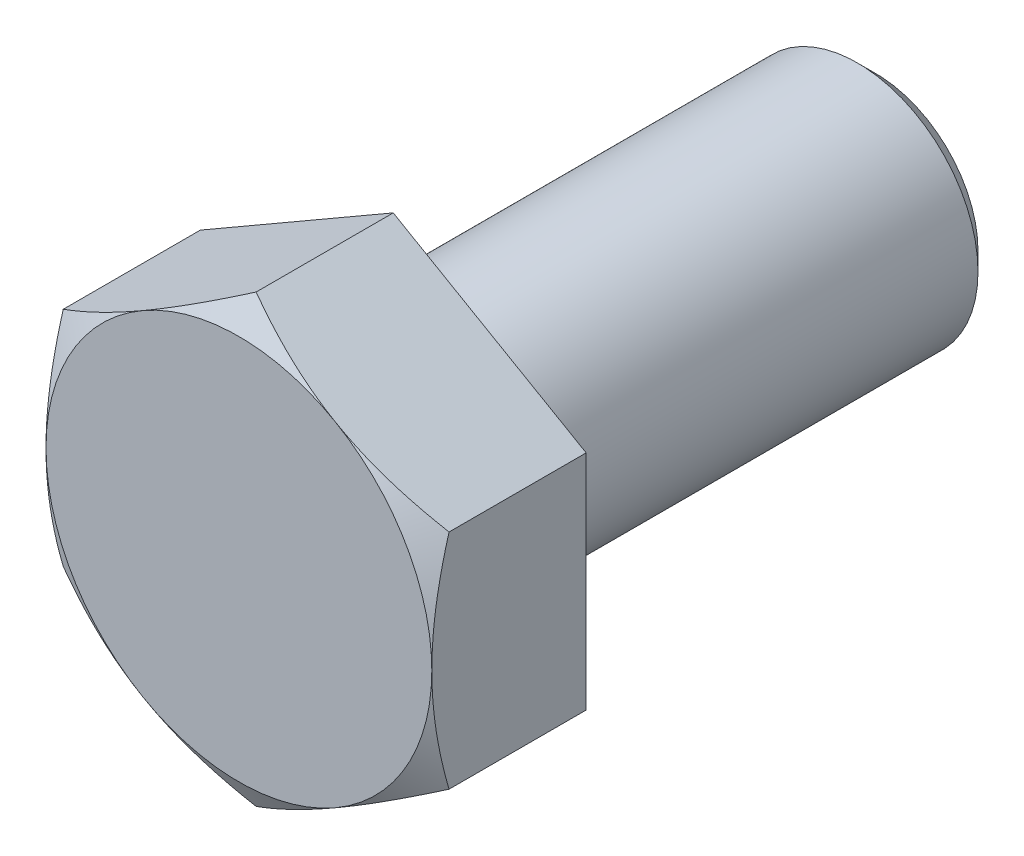
ISO-10303-21;
HEADER;
FILE_DESCRIPTION(('STEP AP214'),'2;1');
FILE_NAME('part.step','',(''),(''),'','','');
FILE_SCHEMA(('AUTOMOTIVE_DESIGN { 1 0 10303 214 1 1 1 1 }'));
ENDSEC;
DATA;
#1=APPLICATION_CONTEXT('core data for automotive mechanical design processes');
#2=APPLICATION_PROTOCOL_DEFINITION('international standard','automotive_design',2000,#1);
#3=PRODUCT_CONTEXT('',#1,'mechanical');
#4=PRODUCT('Part','Part','',(#3));
#5=PRODUCT_RELATED_PRODUCT_CATEGORY('part','',(#4));
#6=PRODUCT_DEFINITION_FORMATION('','',#4);
#7=PRODUCT_DEFINITION_CONTEXT('part definition',#1,'design');
#8=PRODUCT_DEFINITION('design','',#6,#7);
#9=PRODUCT_DEFINITION_SHAPE('','',#8);
#10=(LENGTH_UNIT() NAMED_UNIT(*) SI_UNIT(.MILLI.,.METRE.));
#11=(NAMED_UNIT(*) PLANE_ANGLE_UNIT() SI_UNIT($,.RADIAN.));
#12=(NAMED_UNIT(*) SI_UNIT($,.STERADIAN.) SOLID_ANGLE_UNIT());
#13=UNCERTAINTY_MEASURE_WITH_UNIT(LENGTH_MEASURE(1.E-05),#10,'distance_accuracy_value','');
#14=(GEOMETRIC_REPRESENTATION_CONTEXT(3) GLOBAL_UNCERTAINTY_ASSIGNED_CONTEXT((#13)) GLOBAL_UNIT_ASSIGNED_CONTEXT((#10,
#11,#12)) REPRESENTATION_CONTEXT('',''));
#15=CARTESIAN_POINT('',(0.,0.,0.));
#16=DIRECTION('',(0.,0.,1.));
#17=DIRECTION('',(1.,0.,0.));
#18=AXIS2_PLACEMENT_3D('',#15,#16,#17);
#19=CARTESIAN_POINT('',(3.79177104354675E-06,-4.33273048109597E-05,1.34810339188749));
#20=DIRECTION('',(0.,0.,1.));
#21=DIRECTION('',(1.,0.,0.));
#22=AXIS2_PLACEMENT_3D('',#19,#20,#21);
#23=PLANE('',#22);
#24=CARTESIAN_POINT('',(3.79177104306103E-06,-4.33273048103352E-05,1.3481033922876));
#25=DIRECTION('',(0.,0.,-1.));
#26=DIRECTION('',(-1.,0.,0.));
#27=AXIS2_PLACEMENT_3D('',#24,#25,#26);
#28=CIRCLE('',#27,4.000000000231);
#29=CARTESIAN_POINT('',(1.99991578795662,3.46410909550182,1.34810339235428));
#30=VERTEX_POINT('',#29);
#31=CARTESIAN_POINT('',(4.00000379188654,-4.33273048100741E-05,1.34810339235428));
#32=VERTEX_POINT('',#31);
#33=EDGE_CURVE('E361',#30,#32,#28,.T.);
#34=ORIENTED_EDGE('',*,*,#33,.F.);
#35=CARTESIAN_POINT('',(3.79177104306103E-06,-4.33273048103352E-05,1.3481033922876));
#36=DIRECTION('',(0.,0.,-1.));
#37=DIRECTION('',(-1.,0.,0.));
#38=AXIS2_PLACEMENT_3D('',#35,#36,#37);
#39=CIRCLE('',#38,4.000000000231);
#40=CARTESIAN_POINT('',(-1.99990820441454,3.46410909550181,1.34810339235428));
#41=VERTEX_POINT('',#40);
#42=EDGE_CURVE('E112',#41,#30,#39,.T.);
#43=ORIENTED_EDGE('',*,*,#42,.F.);
#44=CARTESIAN_POINT('',(3.79177104306103E-06,-4.33273048103352E-05,1.3481033922876));
#45=DIRECTION('',(0.,0.,-1.));
#46=DIRECTION('',(-1.,0.,0.));
#47=AXIS2_PLACEMENT_3D('',#44,#45,#46);
#48=CIRCLE('',#47,4.000000000231);
#49=CARTESIAN_POINT('',(-3.99999620834446,-4.3327304810564E-05,1.34810339235428));
#50=VERTEX_POINT('',#49);
#51=EDGE_CURVE('E108',#50,#41,#48,.T.);
#52=ORIENTED_EDGE('',*,*,#51,.F.);
#53=CARTESIAN_POINT('',(3.79177104306103E-06,-4.33273048103352E-05,1.3481033922876));
#54=DIRECTION('',(0.,0.,-1.));
#55=DIRECTION('',(-1.,0.,0.));
#56=AXIS2_PLACEMENT_3D('',#53,#54,#55);
#57=CIRCLE('',#56,4.000000000231);
#58=CARTESIAN_POINT('',(-1.99990820441453,-3.46419575011144,1.34810339235428));
#59=VERTEX_POINT('',#58);
#60=EDGE_CURVE('E106',#59,#50,#57,.T.);
#61=ORIENTED_EDGE('',*,*,#60,.F.);
#62=CARTESIAN_POINT('',(3.79177104307789E-06,-4.33273048103352E-05,1.3481033922876));
#63=DIRECTION('',(0.,0.,-1.));
#64=DIRECTION('',(-1.,0.,0.));
#65=AXIS2_PLACEMENT_3D('',#62,#63,#64);
#66=CIRCLE('',#65,4.000000000231);
#67=CARTESIAN_POINT('',(1.99991578795662,-3.46419575011144,1.34810339235428));
#68=VERTEX_POINT('',#67);
#69=EDGE_CURVE('E39',#68,#59,#66,.T.);
#70=ORIENTED_EDGE('',*,*,#69,.F.);
#71=CARTESIAN_POINT('',(3.79177104306103E-06,-4.33273048103352E-05,1.3481033922876));
#72=DIRECTION('',(0.,0.,-1.));
#73=DIRECTION('',(-1.,0.,0.));
#74=AXIS2_PLACEMENT_3D('',#71,#72,#73);
#75=CIRCLE('',#74,4.000000000231);
#76=EDGE_CURVE('E123',#32,#68,#75,.T.);
#77=ORIENTED_EDGE('',*,*,#76,.F.);
#78=EDGE_LOOP('',(#34,#43,#52,#61,#70,#77));
#79=FACE_BOUND('',#78,.T.);
#80=ADVANCED_FACE('F36',(#79),#23,.T.);
#81=CARTESIAN_POINT('',(3.79177104306103E-06,-4.33273048103352E-05,0.988733553872926));
#82=DIRECTION('',(0.,0.,-1.));
#83=DIRECTION('',(-1.,0.,0.));
#84=AXIS2_PLACEMENT_3D('',#81,#82,#83);
#85=CONICAL_SURFACE('',#84,4.62244681735294,1.04719755);
#86=ORIENTED_EDGE('',*,*,#69,.T.);
#87=CARTESIAN_POINT('',(3.79163709457141E-06,-4.61877773840974,0.990876912722294));
#88=CARTESIAN_POINT('',(-0.162788497504231,-4.52479508048307,1.04515145101499));
#89=CARTESIAN_POINT('',(-0.326884413345985,-4.4300598175244,1.09487619982928));
#90=CARTESIAN_POINT('',(-0.656522634689989,-4.23975426717159,1.18256466618629));
#91=CARTESIAN_POINT('',(-0.822053443931,-4.14419061675741,1.22058653471871));
#92=CARTESIAN_POINT('',(-1.07191170370882,-3.99994334640708,1.26727081158041));
#93=CARTESIAN_POINT('',(-1.15551337791084,-3.9516787290539,1.28111314895853));
#94=CARTESIAN_POINT('',(-1.32311691933625,-3.85491845635499,1.30507449792997));
#95=CARTESIAN_POINT('',(-1.40711877597122,-3.80642280712212,1.31519360748801));
#96=CARTESIAN_POINT('',(-1.57583336835302,-3.70902110648849,1.33153072770129));
#97=CARTESIAN_POINT('',(-1.66054755588023,-3.6601142169511,1.33772890127366));
#98=CARTESIAN_POINT('',(-1.83014251453472,-3.56220426643249,1.3460238116594));
#99=CARTESIAN_POINT('',(-1.91502331531653,-3.51320118833122,1.34811973638863));
#100=CARTESIAN_POINT('',(-1.99990820434845,-3.46419575001622,1.34810339242096));
#101=B_SPLINE_CURVE_WITH_KNOTS('',3,(#87,#88,#89,#90,#91,#92,#93,#94,#95,#96,#97,#98,#99,#100),
.UNSPECIFIED.,.F.,.F.,(4,2,2,2,2,2,4),(0.,0.587193956710365,1.1714212338006,1.46391811883855,
1.75640730721482,2.05036468614835,2.34438025121384),.UNSPECIFIED.);
#102=CARTESIAN_POINT('',(3.79171869659006E-06,-4.61877773836004,0.990876912654175));
#103=VERTEX_POINT('',#102);
#104=EDGE_CURVE('E118',#103,#59,#101,.T.);
#105=ORIENTED_EDGE('',*,*,#104,.F.);
#106=CARTESIAN_POINT('',(1.99991578787,-3.46419574996139,1.34810339238762));
#107=CARTESIAN_POINT('',(1.91503089885496,-3.51320118830945,1.34811973637682));
#108=CARTESIAN_POINT('',(1.83015009807931,-3.56220426642466,1.3460238116564));
#109=CARTESIAN_POINT('',(1.66055513942802,-3.66011421695419,1.33772890127706));
#110=CARTESIAN_POINT('',(1.57584095189786,-3.70902110648856,1.3315307277023));
#111=CARTESIAN_POINT('',(1.40712635951324,-3.80642280712052,1.31519360748726));
#112=CARTESIAN_POINT('',(1.32312450287839,-3.85491845635471,1.30507449792987));
#113=CARTESIAN_POINT('',(1.15552096145219,-3.95167872905458,1.28111314895852));
#114=CARTESIAN_POINT('',(1.07191928724927,-3.99994334640739,1.26727081157983));
#115=CARTESIAN_POINT('',(0.822061027470187,-4.14419061676036,1.22058653471873));
#116=CARTESIAN_POINT('',(0.656530218230293,-4.23975426718124,1.18256466618979));
#117=CARTESIAN_POINT('',(0.326891996877726,-4.43005981752171,1.09487619982253));
#118=CARTESIAN_POINT('',(0.16279608102625,-4.52479508046119,1.04515145099437));
#119=CARTESIAN_POINT('',(3.79186307492258E-06,-4.61877773833713,0.990876912667401));
#120=B_SPLINE_CURVE_WITH_KNOTS('',3,(#106,#107,#108,#109,#110,#111,#112,#113,#114,#115,#116,
#117,#118,#119),.UNSPECIFIED.,.F.,.F.,(4,2,2,2,2,2,4),(0.,0.29401556506985,0.587972944006674,
0.880462132384534,1.17295901742455,1.75718629451911,2.34438025123659),.UNSPECIFIED.);
#121=EDGE_CURVE('E121',#68,#103,#120,.T.);
#122=ORIENTED_EDGE('',*,*,#121,.F.);
#123=EDGE_LOOP('',(#86,#105,#122));
#124=FACE_BOUND('',#123,.T.);
#125=ADVANCED_FACE('F116',(#124),#85,.T.);
#126=CARTESIAN_POINT('',(3.79177104306103E-06,-4.33273048103352E-05,0.988674534124086));
#127=DIRECTION('',(0.,0.,-1.));
#128=DIRECTION('',(-1.,0.,0.));
#129=AXIS2_PLACEMENT_3D('',#126,#127,#128);
#130=CONICAL_SURFACE('',#129,4.6225490425563,1.04719755);
#131=ORIENTED_EDGE('',*,*,#76,.T.);
#132=CARTESIAN_POINT('',(4.00000379172091,-2.3095121496015,0.990818244979904));
#133=CARTESIAN_POINT('',(3.83719763281116,-2.40350281464689,1.04510097104329));
#134=CARTESIAN_POINT('',(3.67308762745474,-2.49824621166345,1.09483352723444));
#135=CARTESIAN_POINT('',(3.34342095346018,-2.68856818816269,1.1825361111439));
#136=CARTESIAN_POINT('',(3.17787578480175,-2.78414012851837,1.2205643043841));
#137=CARTESIAN_POINT('',(2.92799560556909,-2.92840005333423,1.26725653055035));
#138=CARTESIAN_POINT('',(2.84438654192603,-2.97666893673172,1.28110126396343));
#139=CARTESIAN_POINT('',(2.67676812283042,-3.07343779855272,1.30506679889541));
#140=CARTESIAN_POINT('',(2.59275877797436,-3.12193777085871,1.31518769844517));
#141=CARTESIAN_POINT('',(2.42402904308853,-3.21934821350847,1.33152773188274));
#142=CARTESIAN_POINT('',(2.33930720071613,-3.26825952231344,1.33772702279641));
#143=CARTESIAN_POINT('',(2.16969688465878,-3.36617833891242,1.34602343422096));
#144=CARTESIAN_POINT('',(2.08480838130078,-3.41518586383716,1.34811974221371));
#145=CARTESIAN_POINT('',(1.99991578790721,-3.4641957500066,1.34810339242096));
#146=B_SPLINE_CURVE_WITH_KNOTS('',3,(#132,#133,#134,#135,#136,#137,#138,#139,#140,#141,#142,
#143,#144,#145),.UNSPECIFIED.,.F.,.F.,(4,2,2,2,2,2,4),(0.,0.5872470121739,1.17152670288262,
1.46404993062694,1.75656545707178,2.05054948889577,2.34459173280619),.UNSPECIFIED.);
#147=CARTESIAN_POINT('',(4.00000379171867,-2.30951214950594,0.990818244911756));
#148=VERTEX_POINT('',#147);
#149=EDGE_CURVE('E132',#148,#68,#146,.T.);
#150=ORIENTED_EDGE('',*,*,#149,.F.);
#151=CARTESIAN_POINT('',(4.00000379171329,-4.33273048103028E-05,1.34810339238762));
#152=CARTESIAN_POINT('',(4.00000379175031,-0.098067412895049,1.3481197422019));
#153=CARTESIAN_POINT('',(4.00000379176549,-0.196086775787946,1.34602343421796));
#154=CARTESIAN_POINT('',(4.0000037917766,-0.391933026602892,1.33772702279981));
#155=CARTESIAN_POINT('',(4.00000379177253,-0.48975994878791,1.33152773188375));
#156=CARTESIAN_POINT('',(4.00000379176956,-0.684589406962215,1.31518769844443));
#157=CARTESIAN_POINT('',(4.00000379177064,-0.781593619947711,1.30506679889531));
#158=CARTESIAN_POINT('',(4.00000379177145,-0.97513986000081,1.28110126396342));
#159=CARTESIAN_POINT('',(4.00000379177119,-1.07168187483282,1.26725653054976));
#160=CARTESIAN_POINT('',(4.00000379177075,-1.36021442045396,1.22056430438412));
#161=CARTESIAN_POINT('',(4.00000379177089,-1.55136671222785,1.1825361111474));
#162=CARTESIAN_POINT('',(4.00000379177119,-1.93202741506196,1.09483352722769));
#163=CARTESIAN_POINT('',(4.00000379177134,-2.12152254728407,1.04510097102265));
#164=CARTESIAN_POINT('',(4.00000379177104,-2.3095121493694,0.990818244924989));
#165=B_SPLINE_CURVE_WITH_KNOTS('',3,(#151,#152,#153,#154,#155,#156,#157,#158,#159,#160,#161,
#162,#163,#164),.UNSPECIFIED.,.F.,.F.,(4,2,2,2,2,2,4),(0.,0.294042243914776,0.58802627574207,
0.880541802188493,1.17306502993488,1.75734472064793,2.34459173282895),.UNSPECIFIED.);
#166=EDGE_CURVE('E166',#32,#148,#165,.T.);
#167=ORIENTED_EDGE('',*,*,#166,.F.);
#168=EDGE_LOOP('',(#131,#150,#167));
#169=FACE_BOUND('',#168,.T.);
#170=ADVANCED_FACE('F156',(#169),#130,.T.);
#171=CARTESIAN_POINT('',(3.79177104306103E-06,-4.33273048103352E-05,0.988674534124084));
#172=DIRECTION('',(0.,0.,-1.));
#173=DIRECTION('',(-1.,0.,0.));
#174=AXIS2_PLACEMENT_3D('',#171,#172,#173);
#175=CONICAL_SURFACE('',#174,4.6225490425563,1.04719755);
#176=CARTESIAN_POINT('',(1.99991578787,3.46410909535178,1.34810339238762));
#177=CARTESIAN_POINT('',(2.08480838128376,3.41509920921349,1.3481197422019));
#178=CARTESIAN_POINT('',(2.16969688465074,3.36609168430106,1.34602343421796));
#179=CARTESIAN_POINT('',(2.33930720071595,3.26817286771031,1.33772702279981));
#180=CARTESIAN_POINT('',(2.42402904308721,3.21926155890127,1.33152773188375));
#181=CARTESIAN_POINT('',(2.59275877797301,3.12185111624823,1.31518769844443));
#182=CARTESIAN_POINT('',(2.67676812283016,3.073351143943,1.30506679889532));
#183=CARTESIAN_POINT('',(2.84438654192699,2.9765822821218,1.28110126396342));
#184=CARTESIAN_POINT('',(2.92799560557018,2.92831339872335,1.26725653054976));
#185=CARTESIAN_POINT('',(3.17787578480575,2.78405347390771,1.22056430438412));
#186=CARTESIAN_POINT('',(3.34342095346943,2.68848153355636,1.1825361111474));
#187=CARTESIAN_POINT('',(3.67308762745758,2.49815955704352,1.09483352722769));
#188=CARTESIAN_POINT('',(3.83719763280224,2.40341616000894,1.04510097102265));
#189=CARTESIAN_POINT('',(4.00000379167898,2.30942549491924,0.990818244924989));
#190=B_SPLINE_CURVE_WITH_KNOTS('',3,(#176,#177,#178,#179,#180,#181,#182,#183,#184,#185,#186,
#187,#188,#189),.UNSPECIFIED.,.F.,.F.,(4,2,2,2,2,2,4),(0.,0.294042243914777,0.588026275742071,
0.880541802188495,1.17306502993488,1.75734472064793,2.34459173282895),.UNSPECIFIED.);
#191=CARTESIAN_POINT('',(4.00000379177104,2.30942549480562,0.990818244911756));
#192=VERTEX_POINT('',#191);
#193=EDGE_CURVE('E198',#30,#192,#190,.T.);
#194=ORIENTED_EDGE('',*,*,#193,.F.);
#195=ORIENTED_EDGE('',*,*,#33,.T.);
#196=CARTESIAN_POINT('',(4.00000379185492,2.30942549475978,0.990818244979903));
#197=CARTESIAN_POINT('',(4.00000379180034,2.12143589266801,1.04510097104328));
#198=CARTESIAN_POINT('',(4.0000037917787,1.93194076044472,1.09483352723444));
#199=CARTESIAN_POINT('',(4.00000379176342,1.55128005761185,1.1825361111439));
#200=CARTESIAN_POINT('',(4.00000379176965,1.36012776584035,1.2205643043841));
#201=CARTESIAN_POINT('',(4.00000379177174,1.07159522022162,1.26725653055035));
#202=CARTESIAN_POINT('',(4.00000379177123,0.975053205390207,1.28110126396343));
#203=CARTESIAN_POINT('',(4.00000379177085,0.781506965338266,1.30506679889541));
#204=CARTESIAN_POINT('',(4.00000379177099,0.684502752353332,1.31518769844517));
#205=CARTESIAN_POINT('',(4.0000037917711,0.489673294180637,1.33152773188274));
#206=CARTESIAN_POINT('',(4.00000379177107,0.391846371996666,1.33772702279641));
#207=CARTESIAN_POINT('',(4.00000379177102,0.196000121184402,1.34602343422096));
#208=CARTESIAN_POINT('',(4.00000379177099,0.0979807582931406,1.34811974221371));
#209=CARTESIAN_POINT('',(4.00000379177104,-4.33272951850333E-05,1.34810339242096));
#210=B_SPLINE_CURVE_WITH_KNOTS('',3,(#196,#197,#198,#199,#200,#201,#202,#203,#204,#205,#206,
#207,#208,#209),.UNSPECIFIED.,.F.,.F.,(4,2,2,2,2,2,4),(0.,0.587247012173901,1.17152670288262,
1.46404993062695,1.75656545707178,2.05054948889577,2.34459173280619),.UNSPECIFIED.);
#211=EDGE_CURVE('E191',#192,#32,#210,.T.);
#212=ORIENTED_EDGE('',*,*,#211,.F.);
#213=EDGE_LOOP('',(#194,#195,#212));
#214=FACE_BOUND('',#213,.T.);
#215=ADVANCED_FACE('F205',(#214),#175,.T.);
#216=CARTESIAN_POINT('',(3.79177104306103E-06,-4.33273048103352E-05,0.988733553872927));
#217=DIRECTION('',(0.,0.,-1.));
#218=DIRECTION('',(-1.,0.,0.));
#219=AXIS2_PLACEMENT_3D('',#216,#217,#218);
#220=CONICAL_SURFACE('',#219,4.62244681735294,1.04719755);
#221=CARTESIAN_POINT('',(-1.99990820432792,3.46410909535177,1.34810339238762));
#222=CARTESIAN_POINT('',(-1.91502331531287,3.51311453369983,1.34811973637682));
#223=CARTESIAN_POINT('',(-1.83014251453722,3.56211761181504,1.3460238116564));
#224=CARTESIAN_POINT('',(-1.66054755588594,3.66002756234457,1.33772890127706));
#225=CARTESIAN_POINT('',(-1.57583336835577,3.70893445187894,1.3315307277023));
#226=CARTESIAN_POINT('',(-1.40711877597115,3.8063361525109,1.31519360748726));
#227=CARTESIAN_POINT('',(-1.3231169193363,3.85483180174509,1.30507449792987));
#228=CARTESIAN_POINT('',(-1.1555133779101,3.95159207444496,1.28111314895852));
#229=CARTESIAN_POINT('',(-1.07191170370719,3.99985669179777,1.26727081157983));
#230=CARTESIAN_POINT('',(-0.8220534439281,4.14410396215074,1.22058653471873));
#231=CARTESIAN_POINT('',(-0.656522634688207,4.23966761257162,1.18256466618979));
#232=CARTESIAN_POINT('',(-0.32688441333564,4.42997316291209,1.09487619982253));
#233=CARTESIAN_POINT('',(-0.162788497484165,4.52470842585157,1.04515145099437));
#234=CARTESIAN_POINT('',(3.79167901134691E-06,4.61869108372751,0.9908769126674));
#235=B_SPLINE_CURVE_WITH_KNOTS('',3,(#221,#222,#223,#224,#225,#226,#227,#228,#229,#230,#231,
#232,#233,#234),.UNSPECIFIED.,.F.,.F.,(4,2,2,2,2,2,4),(0.,0.29401556506985,0.587972944006674,
0.880462132384535,1.17295901742455,1.75718629451911,2.34438025123659),.UNSPECIFIED.);
#236=CARTESIAN_POINT('',(3.79182338848649E-06,4.61869108375042,0.990876912654174));
#237=VERTEX_POINT('',#236);
#238=EDGE_CURVE('E223',#41,#237,#235,.T.);
#239=ORIENTED_EDGE('',*,*,#238,.F.);
#240=ORIENTED_EDGE('',*,*,#42,.T.);
#241=CARTESIAN_POINT('',(3.79190499087101E-06,4.61869108380013,0.990876912722296));
#242=CARTESIAN_POINT('',(0.162796081046316,4.52470842587345,1.04515145101499));
#243=CARTESIAN_POINT('',(0.32689199688807,4.42997316291478,1.09487619982928));
#244=CARTESIAN_POINT('',(0.656530218232073,4.23966761256197,1.18256466618629));
#245=CARTESIAN_POINT('',(0.822061027473085,4.14410396214779,1.22058653471871));
#246=CARTESIAN_POINT('',(1.07191928725091,3.99985669179746,1.26727081158041));
#247=CARTESIAN_POINT('',(1.15552096145292,3.95159207444428,1.28111314895853));
#248=CARTESIAN_POINT('',(1.32312450287834,3.85483180174537,1.30507449792997));
#249=CARTESIAN_POINT('',(1.40712635951331,3.8063361525125,1.31519360748801));
#250=CARTESIAN_POINT('',(1.5758409518951,3.70893445187887,1.33153072770129));
#251=CARTESIAN_POINT('',(1.66055513942231,3.66002756234148,1.33772890127366));
#252=CARTESIAN_POINT('',(1.8301500980768,3.56211761182287,1.3460238116594));
#253=CARTESIAN_POINT('',(1.91503089885862,3.5131145337216,1.34811973638863));
#254=CARTESIAN_POINT('',(1.99991578789053,3.4641090954066,1.34810339242096));
#255=B_SPLINE_CURVE_WITH_KNOTS('',3,(#241,#242,#243,#244,#245,#246,#247,#248,#249,#250,#251,
#252,#253,#254),.UNSPECIFIED.,.F.,.F.,(4,2,2,2,2,2,4),(0.,0.587193956710364,1.1714212338006,
1.46391811883856,1.75640730721482,2.05036468614835,2.34438025121384),.UNSPECIFIED.);
#256=EDGE_CURVE('E217',#237,#30,#255,.T.);
#257=ORIENTED_EDGE('',*,*,#256,.F.);
#258=EDGE_LOOP('',(#239,#240,#257));
#259=FACE_BOUND('',#258,.T.);
#260=ADVANCED_FACE('F209',(#259),#220,.T.);
#261=CARTESIAN_POINT('',(3.79177104306103E-06,-4.33273048103352E-05,0.988674534124085));
#262=DIRECTION('',(0.,0.,-1.));
#263=DIRECTION('',(-1.,0.,0.));
#264=AXIS2_PLACEMENT_3D('',#261,#262,#263);
#265=CONICAL_SURFACE('',#264,4.6225490425563,1.04719755);
#266=ORIENTED_EDGE('',*,*,#60,.T.);
#267=CARTESIAN_POINT('',(-3.99999620831283,-2.30951214936941,0.990818244979903));
#268=CARTESIAN_POINT('',(-3.99999620825825,-2.12152254727763,1.04510097104329));
#269=CARTESIAN_POINT('',(-3.99999620823661,-1.93202741505434,1.09483352723444));
#270=CARTESIAN_POINT('',(-3.99999620822134,-1.55136671222147,1.1825361111439));
#271=CARTESIAN_POINT('',(-3.99999620822756,-1.36021442044997,1.2205643043841));
#272=CARTESIAN_POINT('',(-3.99999620822966,-1.07168187483125,1.26725653055035));
#273=CARTESIAN_POINT('',(-3.99999620822914,-0.975139859999829,1.28110126396343));
#274=CARTESIAN_POINT('',(-3.99999620822877,-0.781593619947887,1.30506679889541));
#275=CARTESIAN_POINT('',(-3.9999962082289,-0.684589406962954,1.31518769844517));
#276=CARTESIAN_POINT('',(-3.99999620822901,-0.489759948790258,1.33152773188274));
#277=CARTESIAN_POINT('',(-3.99999620822898,-0.391933026606288,1.33772702279641));
#278=CARTESIAN_POINT('',(-3.99999620822893,-0.196086775794023,1.34602343422096));
#279=CARTESIAN_POINT('',(-3.9999962082289,-0.0980674129027621,1.34811974221371));
#280=CARTESIAN_POINT('',(-3.99999620822896,-4.33273144365134E-05,1.34810339242096));
#281=B_SPLINE_CURVE_WITH_KNOTS('',3,(#267,#268,#269,#270,#271,#272,#273,#274,#275,#276,#277,
#278,#279,#280),.UNSPECIFIED.,.F.,.F.,(4,2,2,2,2,2,4),(0.,0.587247012173901,1.17152670288262,
1.46404993062695,1.75656545707178,2.05054948889577,2.34459173280619),.UNSPECIFIED.);
#282=CARTESIAN_POINT('',(-3.99999620817659,-2.30951214944548,0.990818244929212));
#283=VERTEX_POINT('',#282);
#284=EDGE_CURVE('E128',#283,#50,#281,.T.);
#285=ORIENTED_EDGE('',*,*,#284,.F.);
#286=CARTESIAN_POINT('',(-1.99990820432791,-3.4641957499614,1.34810339238762));
#287=CARTESIAN_POINT('',(-2.08480079774167,-3.41518586382311,1.3481197422019));
#288=CARTESIAN_POINT('',(-2.16968930110866,-3.36617833891068,1.34602343421796));
#289=CARTESIAN_POINT('',(-2.33929961717386,-3.26825952231993,1.33772702279981));
#290=CARTESIAN_POINT('',(-2.42402145954512,-3.21934821351089,1.33152773188375));
#291=CARTESIAN_POINT('',(-2.59275119443092,-3.12193777085785,1.31518769844443));
#292=CARTESIAN_POINT('',(-2.67676053928807,-3.07343779855262,1.30506679889532));
#293=CARTESIAN_POINT('',(-2.8443789583849,-2.97666893673142,1.28110126396342));
#294=CARTESIAN_POINT('',(-2.92798802202809,-2.92840005333297,1.26725653054976));
#295=CARTESIAN_POINT('',(-3.17786820126367,-2.78414012851733,1.22056430438412));
#296=CARTESIAN_POINT('',(-3.34341336992735,-2.68856818816598,1.1825361111474));
#297=CARTESIAN_POINT('',(-3.67308004391549,-2.49824621165314,1.09483352722769));
#298=CARTESIAN_POINT('',(-3.83719004926015,-2.40350281461856,1.04510097102265));
#299=CARTESIAN_POINT('',(-3.99999620813689,-2.30951214952887,0.990818244924989));
#300=B_SPLINE_CURVE_WITH_KNOTS('',3,(#286,#287,#288,#289,#290,#291,#292,#293,#294,#295,#296,
#297,#298,#299),.UNSPECIFIED.,.F.,.F.,(4,2,2,2,2,2,4),(0.,0.294042243914777,0.588026275742071,
0.880541802188494,1.17306502993488,1.75734472064793,2.34459173282895),.UNSPECIFIED.);
#301=EDGE_CURVE('E125',#59,#283,#300,.T.);
#302=ORIENTED_EDGE('',*,*,#301,.F.);
#303=EDGE_LOOP('',(#266,#285,#302));
#304=FACE_BOUND('',#303,.T.);
#305=ADVANCED_FACE('F126',(#304),#265,.T.);
#306=CARTESIAN_POINT('',(3.79177104306103E-06,-4.33273048103352E-05,0.988674534124086));
#307=DIRECTION('',(0.,0.,-1.));
#308=DIRECTION('',(-1.,0.,0.));
#309=AXIS2_PLACEMENT_3D('',#306,#307,#308);
#310=CONICAL_SURFACE('',#309,4.6225490425563,1.04719755);
#311=ORIENTED_EDGE('',*,*,#51,.T.);
#312=CARTESIAN_POINT('',(-3.99999620817883,2.30942549499188,0.990818244979904));
#313=CARTESIAN_POINT('',(-3.83719004926907,2.40341616003727,1.04510097104329));
#314=CARTESIAN_POINT('',(-3.67308004391265,2.49815955705383,1.09483352723444));
#315=CARTESIAN_POINT('',(-3.34341336991809,2.68848153355307,1.1825361111439));
#316=CARTESIAN_POINT('',(-3.17786820125966,2.78405347390875,1.2205643043841));
#317=CARTESIAN_POINT('',(-2.92798802202701,2.92831339872461,1.26725653055035));
#318=CARTESIAN_POINT('',(-2.84437895838394,2.9765822821221,1.28110126396343));
#319=CARTESIAN_POINT('',(-2.67676053928834,3.0733511439431,1.30506679889541));
#320=CARTESIAN_POINT('',(-2.59275119443228,3.12185111624909,1.31518769844517));
#321=CARTESIAN_POINT('',(-2.42402145954644,3.21926155889885,1.33152773188274));
#322=CARTESIAN_POINT('',(-2.33929961717405,3.26817286770382,1.33772702279641));
#323=CARTESIAN_POINT('',(-2.16968930111669,3.3660916843028,1.34602343422096));
#324=CARTESIAN_POINT('',(-2.0848007977587,3.41509920922754,1.34811974221371));
#325=CARTESIAN_POINT('',(-1.99990820436513,3.46410909539697,1.34810339242096));
#326=B_SPLINE_CURVE_WITH_KNOTS('',3,(#312,#313,#314,#315,#316,#317,#318,#319,#320,#321,#322,
#323,#324,#325),.UNSPECIFIED.,.F.,.F.,(4,2,2,2,2,2,4),(0.,0.5872470121739,1.17152670288262,
1.46404993062694,1.75656545707177,2.05054948889577,2.34459173280619),.UNSPECIFIED.);
#327=CARTESIAN_POINT('',(-3.99999620817659,2.30942549489632,0.990818244911758));
#328=VERTEX_POINT('',#327);
#329=EDGE_CURVE('E231',#328,#41,#326,.T.);
#330=ORIENTED_EDGE('',*,*,#329,.F.);
#331=CARTESIAN_POINT('',(-3.99999620817121,-4.33273048107927E-05,1.34810339238762));
#332=CARTESIAN_POINT('',(-3.99999620820822,0.0979807582854278,1.3481197422019));
#333=CARTESIAN_POINT('',(-3.9999962082234,0.196000121178325,1.34602343421796));
#334=CARTESIAN_POINT('',(-3.99999620823451,0.391846371993272,1.33772702279981));
#335=CARTESIAN_POINT('',(-3.99999620823044,0.489673294178289,1.33152773188375));
#336=CARTESIAN_POINT('',(-3.99999620822748,0.684502752352594,1.31518769844443));
#337=CARTESIAN_POINT('',(-3.99999620822855,0.78150696533809,1.30506679889532));
#338=CARTESIAN_POINT('',(-3.99999620822936,0.975053205391188,1.28110126396342));
#339=CARTESIAN_POINT('',(-3.9999962082291,1.0715952202232,1.26725653054976));
#340=CARTESIAN_POINT('',(-3.99999620822866,1.36012776584434,1.22056430438412));
#341=CARTESIAN_POINT('',(-3.99999620822881,1.55128005761823,1.1825361111474));
#342=CARTESIAN_POINT('',(-3.99999620822911,1.93194076045234,1.09483352722769));
#343=CARTESIAN_POINT('',(-3.99999620822925,2.12143589267445,1.04510097102265));
#344=CARTESIAN_POINT('',(-3.99999620822896,2.30942549475978,0.99081824492499));
#345=B_SPLINE_CURVE_WITH_KNOTS('',3,(#331,#332,#333,#334,#335,#336,#337,#338,#339,#340,#341,
#342,#343,#344),.UNSPECIFIED.,.F.,.F.,(4,2,2,2,2,2,4),(0.,0.294042243914776,0.58802627574207,
0.880541802188493,1.17306502993488,1.75734472064793,2.34459173282894),.UNSPECIFIED.);
#346=EDGE_CURVE('E251',#50,#328,#345,.T.);
#347=ORIENTED_EDGE('',*,*,#346,.F.);
#348=EDGE_LOOP('',(#311,#330,#347));
#349=FACE_BOUND('',#348,.T.);
#350=ADVANCED_FACE('F436',(#349),#310,.T.);
#351=CARTESIAN_POINT('',(3.79177104583659E-06,-4.61877773839026,-1.85189660811251));
#352=DIRECTION('',(-0.499977999031957,-0.86603810567665,0.));
#353=DIRECTION('',(0.86603810567665,-0.499977999031957,0.));
#354=AXIS2_PLACEMENT_3D('',#351,#352,#353);
#355=PLANE('',#354);
#356=DIRECTION('',(0.86603810567665,-0.499977999031957,0.));
#357=VECTOR('',#356,1.);
#358=CARTESIAN_POINT('',(-3.99999620822896,-2.30951214947571,-1.85189660811251));
#359=LINE('',#358,#357);
#360=CARTESIAN_POINT('',(-3.99999620822896,-2.30951214947571,-1.85189660811251));
#361=VERTEX_POINT('',#360);
#362=CARTESIAN_POINT('',(3.79177104510386E-06,-4.61877773839026,-1.85189660811251));
#363=VERTEX_POINT('',#362);
#364=EDGE_CURVE('E290',#361,#363,#359,.T.);
#365=ORIENTED_EDGE('',*,*,#364,.T.);
#366=DIRECTION('',(0.,0.,1.));
#367=VECTOR('',#366,1.);
#368=CARTESIAN_POINT('',(3.79177104479575E-06,-4.61877773839026,-1.85189660811251));
#369=LINE('',#368,#367);
#370=EDGE_CURVE('E136',#103,#363,#369,.F.);
#371=ORIENTED_EDGE('',*,*,#370,.F.);
#372=ORIENTED_EDGE('',*,*,#104,.T.);
#373=ORIENTED_EDGE('',*,*,#301,.T.);
#374=DIRECTION('',(0.,0.,1.));
#375=VECTOR('',#374,1.);
#376=CARTESIAN_POINT('',(-3.99999620822896,-2.30951214947571,-1.85189660811251));
#377=LINE('',#376,#375);
#378=EDGE_CURVE('E293',#361,#283,#377,.T.);
#379=ORIENTED_EDGE('',*,*,#378,.F.);
#380=EDGE_LOOP('',(#365,#371,#372,#373,#379));
#381=FACE_BOUND('',#380,.T.);
#382=ADVANCED_FACE('F134',(#381),#355,.T.);
#383=CARTESIAN_POINT('',(4.00000379177104,-2.30951214947571,-1.85189660811251));
#384=DIRECTION('',(0.499977999031958,-0.86603810567665,0.));
#385=DIRECTION('',(0.86603810567665,0.499977999031958,0.));
#386=AXIS2_PLACEMENT_3D('',#383,#384,#385);
#387=PLANE('',#386);
#388=DIRECTION('',(0.866038105676649,0.499977999031958,0.));
#389=VECTOR('',#388,1.);
#390=CARTESIAN_POINT('',(3.79177104583659E-06,-4.61877773839026,-1.85189660811251));
#391=LINE('',#390,#389);
#392=CARTESIAN_POINT('',(4.00000379177104,-2.30951214947571,-1.85189660811251));
#393=VERTEX_POINT('',#392);
#394=EDGE_CURVE('E292',#363,#393,#391,.T.);
#395=ORIENTED_EDGE('',*,*,#394,.T.);
#396=DIRECTION('',(0.,0.,-1.));
#397=VECTOR('',#396,1.);
#398=CARTESIAN_POINT('',(4.00000379177104,-2.30951214947571,-1.85189660811251));
#399=LINE('',#398,#397);
#400=EDGE_CURVE('E199',#148,#393,#399,.T.);
#401=ORIENTED_EDGE('',*,*,#400,.F.);
#402=ORIENTED_EDGE('',*,*,#149,.T.);
#403=ORIENTED_EDGE('',*,*,#121,.T.);
#404=ORIENTED_EDGE('',*,*,#370,.T.);
#405=EDGE_LOOP('',(#395,#401,#402,#403,#404));
#406=FACE_BOUND('',#405,.T.);
#407=ADVANCED_FACE('F177',(#406),#387,.T.);
#408=CARTESIAN_POINT('',(4.00000379177104,2.30942549486609,-1.85189660811251));
#409=DIRECTION('',(1.,0.,0.));
#410=DIRECTION('',(0.,0.,-1.));
#411=AXIS2_PLACEMENT_3D('',#408,#409,#410);
#412=PLANE('',#411);
#413=DIRECTION('',(0.,0.,1.));
#414=VECTOR('',#413,1.);
#415=CARTESIAN_POINT('',(4.00000379177104,2.30942549486609,-1.85189660811251));
#416=LINE('',#415,#414);
#417=CARTESIAN_POINT('',(4.00000379177104,2.30942549486609,-1.85189660811251));
#418=VERTEX_POINT('',#417);
#419=EDGE_CURVE('E272',#192,#418,#416,.F.);
#420=ORIENTED_EDGE('',*,*,#419,.F.);
#421=ORIENTED_EDGE('',*,*,#211,.T.);
#422=ORIENTED_EDGE('',*,*,#166,.T.);
#423=ORIENTED_EDGE('',*,*,#400,.T.);
#424=DIRECTION('',(0.,1.,0.));
#425=VECTOR('',#424,1.);
#426=CARTESIAN_POINT('',(4.00000379177104,-4.33273048109597E-05,-1.85189660811251));
#427=LINE('',#426,#425);
#428=EDGE_CURVE('E301',#393,#418,#427,.T.);
#429=ORIENTED_EDGE('',*,*,#428,.T.);
#430=EDGE_LOOP('',(#420,#421,#422,#423,#429));
#431=FACE_BOUND('',#430,.T.);
#432=ADVANCED_FACE('F180',(#431),#412,.T.);
#433=CARTESIAN_POINT('',(3.79177104028547E-06,4.61869108378064,-1.85189660811251));
#434=DIRECTION('',(0.499977999031957,0.86603810567665,0.));
#435=DIRECTION('',(-0.86603810567665,0.499977999031957,0.));
#436=AXIS2_PLACEMENT_3D('',#433,#434,#435);
#437=PLANE('',#436);
#438=DIRECTION('',(0.,0.,1.));
#439=VECTOR('',#438,1.);
#440=CARTESIAN_POINT('',(3.79177104045895E-06,4.61869108378064,-1.85189660811251));
#441=LINE('',#440,#439);
#442=CARTESIAN_POINT('',(3.79177104059049E-06,4.61869108378064,-1.85189660811251));
#443=VERTEX_POINT('',#442);
#444=EDGE_CURVE('E230',#237,#443,#441,.F.);
#445=ORIENTED_EDGE('',*,*,#444,.F.);
#446=ORIENTED_EDGE('',*,*,#256,.T.);
#447=ORIENTED_EDGE('',*,*,#193,.T.);
#448=ORIENTED_EDGE('',*,*,#419,.T.);
#449=DIRECTION('',(-0.86603810567665,0.499977999031956,0.));
#450=VECTOR('',#449,1.);
#451=CARTESIAN_POINT('',(4.00000379177104,2.30942549486609,-1.85189660811251));
#452=LINE('',#451,#450);
#453=EDGE_CURVE('E297',#418,#443,#452,.T.);
#454=ORIENTED_EDGE('',*,*,#453,.T.);
#455=EDGE_LOOP('',(#445,#446,#447,#448,#454));
#456=FACE_BOUND('',#455,.T.);
#457=ADVANCED_FACE('F186',(#456),#437,.T.);
#458=CARTESIAN_POINT('',(-3.99999620822896,2.30942549486609,-1.85189660811251));
#459=DIRECTION('',(-0.499977999031958,0.866038105676649,0.));
#460=DIRECTION('',(-0.866038105676649,-0.499977999031958,0.));
#461=AXIS2_PLACEMENT_3D('',#458,#459,#460);
#462=PLANE('',#461);
#463=DIRECTION('',(0.,0.,1.));
#464=VECTOR('',#463,1.);
#465=CARTESIAN_POINT('',(-3.99999620822896,2.30942549486609,-1.85189660811251));
#466=LINE('',#465,#464);
#467=CARTESIAN_POINT('',(-3.99999620822896,2.30942549486609,-1.85189660811251));
#468=VERTEX_POINT('',#467);
#469=EDGE_CURVE('E262',#328,#468,#466,.F.);
#470=ORIENTED_EDGE('',*,*,#469,.F.);
#471=ORIENTED_EDGE('',*,*,#329,.T.);
#472=ORIENTED_EDGE('',*,*,#238,.T.);
#473=ORIENTED_EDGE('',*,*,#444,.T.);
#474=DIRECTION('',(-0.86603810567665,-0.499977999031958,0.));
#475=VECTOR('',#474,1.);
#476=CARTESIAN_POINT('',(3.79177104028547E-06,4.61869108378064,-1.85189660811251));
#477=LINE('',#476,#475);
#478=EDGE_CURVE('E54',#443,#468,#477,.T.);
#479=ORIENTED_EDGE('',*,*,#478,.T.);
#480=EDGE_LOOP('',(#470,#471,#472,#473,#479));
#481=FACE_BOUND('',#480,.T.);
#482=ADVANCED_FACE('F237',(#481),#462,.T.);
#483=CARTESIAN_POINT('',(-3.99999620822896,-2.30951214947571,-1.85189660811251));
#484=DIRECTION('',(-1.,0.,0.));
#485=DIRECTION('',(0.,0.,1.));
#486=AXIS2_PLACEMENT_3D('',#483,#484,#485);
#487=PLANE('',#486);
#488=DIRECTION('',(0.,1.,0.));
#489=VECTOR('',#488,1.);
#490=CARTESIAN_POINT('',(-3.99999620822896,-4.33273048109597E-05,-1.85189660811251));
#491=LINE('',#490,#489);
#492=EDGE_CURVE('E284',#468,#361,#491,.F.);
#493=ORIENTED_EDGE('',*,*,#492,.T.);
#494=ORIENTED_EDGE('',*,*,#378,.T.);
#495=ORIENTED_EDGE('',*,*,#284,.T.);
#496=ORIENTED_EDGE('',*,*,#346,.T.);
#497=ORIENTED_EDGE('',*,*,#469,.T.);
#498=EDGE_LOOP('',(#493,#494,#495,#496,#497));
#499=FACE_BOUND('',#498,.T.);
#500=ADVANCED_FACE('F241',(#499),#487,.T.);
#501=CARTESIAN_POINT('',(3.79177104306103E-06,-1.25004332730481,-11.8518966081125));
#502=DIRECTION('',(0.,0.,-1.));
#503=DIRECTION('',(-1.,0.,0.));
#504=AXIS2_PLACEMENT_3D('',#501,#502,#503);
#505=PLANE('',#504);
#506=CARTESIAN_POINT('',(3.79177104306103E-06,-4.33273048103352E-05,-11.8518966083024));
#507=DIRECTION('',(0.,0.,1.));
#508=DIRECTION('',(1.,0.,0.));
#509=AXIS2_PLACEMENT_3D('',#506,#507,#508);
#510=CIRCLE('',#509,2.12500000017712);
#511=CARTESIAN_POINT('',(2.12500379194817,-4.33273048103352E-05,-11.8518966083024));
#512=VERTEX_POINT('',#511);
#513=EDGE_CURVE('E287',#512,#512,#510,.T.);
#514=ORIENTED_EDGE('',*,*,#513,.F.);
#515=EDGE_LOOP('',(#514));
#516=FACE_BOUND('',#515,.T.);
#517=ADVANCED_FACE('F246',(#516),#505,.T.);
#518=CARTESIAN_POINT('',(3.79177104347736E-06,-4.33273048109597E-05,-1.85189660811251));
#519=DIRECTION('',(0.,0.,1.));
#520=DIRECTION('',(1.,0.,0.));
#521=AXIS2_PLACEMENT_3D('',#518,#519,#520);
#522=PLANE('',#521);
#523=CARTESIAN_POINT('',(3.79177104306103E-06,-4.33273048103352E-05,-1.85189660811251));
#524=DIRECTION('',(0.,0.,-1.));
#525=DIRECTION('',(0.,-1.,0.));
#526=AXIS2_PLACEMENT_3D('',#523,#524,#525);
#527=CIRCLE('',#526,2.7);
#528=CARTESIAN_POINT('',(3.79177104190374E-06,-2.70004332730481,-1.85189660811251));
#529=VERTEX_POINT('',#528);
#530=EDGE_CURVE('E310',#529,#529,#527,.F.);
#531=ORIENTED_EDGE('',*,*,#530,.T.);
#532=EDGE_LOOP('',(#531));
#533=FACE_BOUND('',#532,.T.);
#534=ORIENTED_EDGE('',*,*,#478,.F.);
#535=ORIENTED_EDGE('',*,*,#453,.F.);
#536=ORIENTED_EDGE('',*,*,#428,.F.);
#537=ORIENTED_EDGE('',*,*,#394,.F.);
#538=ORIENTED_EDGE('',*,*,#364,.F.);
#539=ORIENTED_EDGE('',*,*,#492,.F.);
#540=EDGE_LOOP('',(#534,#535,#536,#537,#538,#539));
#541=FACE_BOUND('',#540,.T.);
#542=ADVANCED_FACE('F352',(#533,#541),#522,.F.);
#543=CARTESIAN_POINT('',(3.79177104306103E-06,-4.33273048103352E-05,-11.4768966079986));
#544=DIRECTION('',(0.,0.,1.));
#545=DIRECTION('',(1.,0.,0.));
#546=AXIS2_PLACEMENT_3D('',#543,#544,#545);
#547=CONICAL_SURFACE('',#546,2.49999999979877,0.785398162487954);
#548=ORIENTED_EDGE('',*,*,#513,.T.);
#549=EDGE_LOOP('',(#548));
#550=FACE_BOUND('',#549,.T.);
#551=CARTESIAN_POINT('',(3.79177104306103E-06,-4.33273048103352E-05,-11.4768966081125));
#552=DIRECTION('',(0.,0.,-1.));
#553=DIRECTION('',(-1.,0.,0.));
#554=AXIS2_PLACEMENT_3D('',#551,#552,#553);
#555=CIRCLE('',#554,2.5);
#556=CARTESIAN_POINT('',(-2.49999620822896,-4.33273048103352E-05,-11.4768966081125));
#557=VERTEX_POINT('',#556);
#558=EDGE_CURVE('E45',#557,#557,#555,.F.);
#559=ORIENTED_EDGE('',*,*,#558,.F.);
#560=EDGE_LOOP('',(#559));
#561=FACE_BOUND('',#560,.T.);
#562=ADVANCED_FACE('F335',(#550,#561),#547,.T.);
#563=CARTESIAN_POINT('',(3.79177104306103E-06,-4.33273048103352E-05,-2.05189660811251));
#564=DIRECTION('',(0.,0.,1.));
#565=DIRECTION('',(1.,0.,0.));
#566=AXIS2_PLACEMENT_3D('',#563,#564,#565);
#567=TOROIDAL_SURFACE('',#566,2.7,0.2);
#568=ORIENTED_EDGE('',*,*,#530,.F.);
#569=EDGE_LOOP('',(#568));
#570=FACE_BOUND('',#569,.T.);
#571=CARTESIAN_POINT('',(3.79177104306103E-06,-4.33273048103352E-05,-2.05189660811251));
#572=DIRECTION('',(0.,0.,-1.));
#573=DIRECTION('',(-1.,0.,0.));
#574=AXIS2_PLACEMENT_3D('',#571,#572,#573);
#575=CIRCLE('',#574,2.5);
#576=CARTESIAN_POINT('',(-2.49999620822896,-4.33273048103352E-05,-2.05189660811251));
#577=VERTEX_POINT('',#576);
#578=EDGE_CURVE('E11',#577,#577,#575,.T.);
#579=ORIENTED_EDGE('',*,*,#578,.F.);
#580=EDGE_LOOP('',(#579));
#581=FACE_BOUND('',#580,.T.);
#582=ADVANCED_FACE('F329',(#570,#581),#567,.F.);
#583=CARTESIAN_POINT('',(3.79177104306103E-06,-4.33273048103352E-05,-6.85189660811251));
#584=DIRECTION('',(0.,0.,-1.));
#585=DIRECTION('',(-1.,0.,0.));
#586=AXIS2_PLACEMENT_3D('',#583,#584,#585);
#587=CYLINDRICAL_SURFACE('',#586,2.5);
#588=ORIENTED_EDGE('',*,*,#578,.T.);
#589=EDGE_LOOP('',(#588));
#590=FACE_BOUND('',#589,.T.);
#591=ORIENTED_EDGE('',*,*,#558,.T.);
#592=EDGE_LOOP('',(#591));
#593=FACE_BOUND('',#592,.T.);
#594=ADVANCED_FACE('F334',(#590,#593),#587,.T.);
#595=CLOSED_SHELL('',(#80,#125,#170,#215,#260,#305,#350,#382,#407,#432,#457,#482,#500,#517,#542,
#562,#582,#594));
#596=MANIFOLD_SOLID_BREP('B2',#595);
#597=ADVANCED_BREP_SHAPE_REPRESENTATION('',(#18,#596),#14);
#598=SHAPE_DEFINITION_REPRESENTATION(#9,#597);
ENDSEC;
END-ISO-10303-21;
